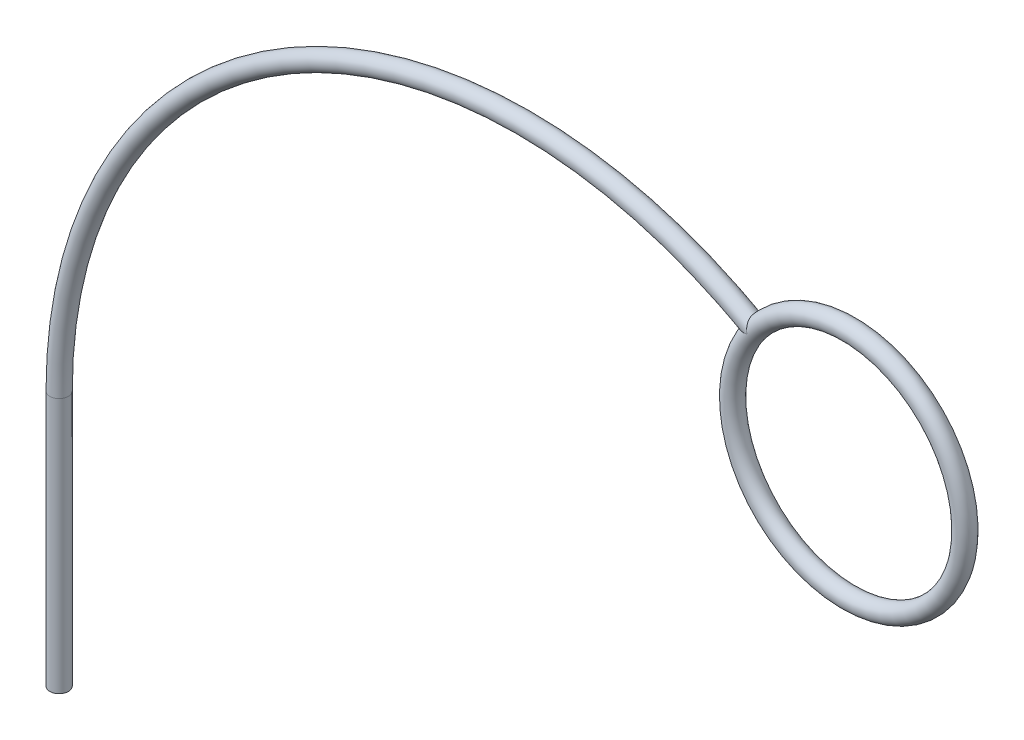
ISO-10303-21;
HEADER;
FILE_DESCRIPTION(('STEP AP214'),'2;1');
FILE_NAME('part.step','',(''),(''),'','','');
FILE_SCHEMA(('AUTOMOTIVE_DESIGN { 1 0 10303 214 1 1 1 1 }'));
ENDSEC;
DATA;
#1=APPLICATION_CONTEXT('core data for automotive mechanical design processes');
#2=APPLICATION_PROTOCOL_DEFINITION('international standard','automotive_design',2000,#1);
#3=PRODUCT_CONTEXT('',#1,'mechanical');
#4=PRODUCT('Part','Part','',(#3));
#5=PRODUCT_RELATED_PRODUCT_CATEGORY('part','',(#4));
#6=PRODUCT_DEFINITION_FORMATION('','',#4);
#7=PRODUCT_DEFINITION_CONTEXT('part definition',#1,'design');
#8=PRODUCT_DEFINITION('design','',#6,#7);
#9=PRODUCT_DEFINITION_SHAPE('','',#8);
#10=(LENGTH_UNIT() NAMED_UNIT(*) SI_UNIT(.MILLI.,.METRE.));
#11=(NAMED_UNIT(*) PLANE_ANGLE_UNIT() SI_UNIT($,.RADIAN.));
#12=(NAMED_UNIT(*) SI_UNIT($,.STERADIAN.) SOLID_ANGLE_UNIT());
#13=UNCERTAINTY_MEASURE_WITH_UNIT(LENGTH_MEASURE(1.E-05),#10,'distance_accuracy_value','');
#14=(GEOMETRIC_REPRESENTATION_CONTEXT(3) GLOBAL_UNCERTAINTY_ASSIGNED_CONTEXT((#13)) GLOBAL_UNIT_ASSIGNED_CONTEXT((#10,
#11,#12)) REPRESENTATION_CONTEXT('',''));
#15=CARTESIAN_POINT('',(0.,0.,0.));
#16=DIRECTION('',(0.,0.,1.));
#17=DIRECTION('',(1.,0.,0.));
#18=AXIS2_PLACEMENT_3D('',#15,#16,#17);
#19=CARTESIAN_POINT('',(18.2815570628505,3.6246661446639,0.));
#20=DIRECTION('',(0.,0.,-1.));
#21=DIRECTION('',(-1.,0.,0.));
#22=AXIS2_PLACEMENT_3D('',#19,#20,#21);
#23=TOROIDAL_SURFACE('',#22,20.,0.4);
#24=CARTESIAN_POINT('',(-1.7184429371495,3.6246661446639,0.));
#25=DIRECTION('',(0.,1.,0.));
#26=DIRECTION('',(0.,0.,1.));
#27=AXIS2_PLACEMENT_3D('',#24,#25,#26);
#28=CIRCLE('',#27,0.4);
#29=CARTESIAN_POINT('',(-1.7184429371495,3.6246661446639,0.4));
#30=VERTEX_POINT('',#29);
#31=EDGE_CURVE('E11',#30,#30,#28,.T.);
#32=ORIENTED_EDGE('',*,*,#31,.T.);
#33=EDGE_LOOP('',(#32));
#34=FACE_BOUND('',#33,.T.);
#35=CARTESIAN_POINT('',(28.2815570628505,20.9451742203527,-0.4));
#36=CARTESIAN_POINT('',(28.2802449825687,20.9449094316311,-0.399999985185975));
#37=CARTESIAN_POINT('',(28.2789328875301,20.9446443803772,-0.399997046519748));
#38=CARTESIAN_POINT('',(28.2300372082474,20.9347574989657,-0.399778371642649));
#39=CARTESIAN_POINT('',(28.1824541964685,20.9247953332454,-0.395712912776125));
#40=CARTESIAN_POINT('',(28.0886786609039,20.9045164332839,-0.379338898890182));
#41=CARTESIAN_POINT('',(28.0424879912974,20.8941992623015,-0.367019818997793));
#42=CARTESIAN_POINT('',(27.9709202273098,20.8777632566153,-0.339678796931704));
#43=CARTESIAN_POINT('',(27.9444412842281,20.8715737428396,-0.327576474530821));
#44=CARTESIAN_POINT('',(27.8935286241451,20.8594906103549,-0.29954318114244));
#45=CARTESIAN_POINT('',(27.8690907584986,20.8535964016875,-0.283620244413451));
#46=CARTESIAN_POINT('',(27.8289330575779,20.8437854611385,-0.252008199426075));
#47=CARTESIAN_POINT('',(27.8125431482702,20.8397377565341,-0.237215157459504));
#48=CARTESIAN_POINT('',(27.7822271689137,20.8321892973009,-0.205152010422065));
#49=CARTESIAN_POINT('',(27.7682978338793,20.8286878186067,-0.187885243763828));
#50=CARTESIAN_POINT('',(27.746470145193,20.8231670007181,-0.155022206934537));
#51=CARTESIAN_POINT('',(27.7379190697795,20.8209910061566,-0.139888087779509));
#52=CARTESIAN_POINT('',(27.7233366205699,20.8172674066555,-0.10837117755116));
#53=CARTESIAN_POINT('',(27.7173034168709,20.8157193453786,-0.0919893035785469));
#54=CARTESIAN_POINT('',(27.708162024422,20.8133696326615,-0.0582377716207111));
#55=CARTESIAN_POINT('',(27.7050748709504,20.8125733494632,-0.0408619353274321));
#56=CARTESIAN_POINT('',(27.7021791365866,20.8118265339348,-0.00582133855980215));
#57=CARTESIAN_POINT('',(27.7023690656429,20.8118756172263,0.0118432869554302));
#58=CARTESIAN_POINT('',(27.705797851746,20.8127597016421,0.0448425478468128));
#59=CARTESIAN_POINT('',(27.708693531981,20.8135062409989,0.0602169169853818));
#60=CARTESIAN_POINT('',(27.7168445604847,20.8156014115963,0.0902783005875124));
#61=CARTESIAN_POINT('',(27.7221003125876,20.8169501458789,0.104965196941813));
#62=CARTESIAN_POINT('',(27.7349355445933,20.8202303133207,0.133983255863529));
#63=CARTESIAN_POINT('',(27.7426063637904,20.8221845921845,0.148270975428817));
#64=CARTESIAN_POINT('',(27.7597902611328,20.8265388965787,0.175607701456373));
#65=CARTESIAN_POINT('',(27.7693042851004,20.8289391509311,0.188656066811256));
#66=CARTESIAN_POINT('',(27.7957352768268,20.8355649599992,0.220601287775842));
#67=CARTESIAN_POINT('',(27.8137579910303,20.8400450589807,0.23853303258873));
#68=CARTESIAN_POINT('',(27.8523699309877,20.8495275701599,0.271224662175176));
#69=CARTESIAN_POINT('',(27.8729659859757,20.8545313662046,0.285975811109096));
#70=CARTESIAN_POINT('',(27.9253472367563,20.8670858461516,0.318335228379443));
#71=CARTESIAN_POINT('',(27.9580745120939,20.8747901002297,0.334353948340157));
#72=CARTESIAN_POINT('',(28.0256103020936,20.8903423357701,0.36092009609409));
#73=CARTESIAN_POINT('',(28.0604209968208,20.898190461606,0.371461676971787));
#74=CARTESIAN_POINT('',(28.1255838408933,20.912535896166,0.386322647025955));
#75=CARTESIAN_POINT('',(28.1557736632117,20.9190510993041,0.391360990795307));
#76=CARTESIAN_POINT('',(28.2165129465614,20.9318829420326,0.398123765955283));
#77=CARTESIAN_POINT('',(28.2470616403969,20.9381999261265,0.399854300627917));
#78=CARTESIAN_POINT('',(28.2789328687982,20.9446443755551,0.399997055411889));
#79=CARTESIAN_POINT('',(28.2802449639673,20.9449094267799,0.399999994492733));
#80=CARTESIAN_POINT('',(28.2815570628505,20.9451742203527,0.4));
#81=B_SPLINE_CURVE_WITH_KNOTS('',3,(#35,#36,#37,#38,#39,#40,#41,#42,#43,#44,#45,#46,#47,#48,#49,
#50,#51,#52,#53,#54,#55,#56,#57,#58,#59,#60,#61,#62,#63,#64,#65,#66,#67,#68,#69,#70,#71,#72,#73,
#74,#75,#76,#77,#78,#79,#80),.UNSPECIFIED.,.F.,.F.,(4,2,2,2,2,2,2,2,2,2,2,2,2,2,2,2,2,2,2,2,2,2,
4),(0.,0.00401578915933876,0.149649833449716,0.295469942080937,0.38451773264468,
0.473379883479211,0.540499240298709,0.607528854919576,0.659880595409205,0.712194221907371,
0.7648786415831,0.817539106897504,0.864313278724592,0.911095457177411,0.959917733280874,
1.00876512873317,1.08577364173073,1.16299104582411,1.27411429112072,1.38535591941979,
1.47905948025973,1.57258997990139,1.57660576906311),.UNSPECIFIED.);
#82=CARTESIAN_POINT('',(28.2815570628505,20.9451742203527,-0.4));
#83=VERTEX_POINT('',#82);
#84=CARTESIAN_POINT('',(28.2815570628505,20.9451742203527,0.4));
#85=VERTEX_POINT('',#84);
#86=EDGE_CURVE('E48',#83,#85,#81,.T.);
#87=ORIENTED_EDGE('',*,*,#86,.T.);
#88=CARTESIAN_POINT('',(28.2815570628505,20.9451742203527,0.4));
#89=CARTESIAN_POINT('',(28.2812922728258,20.9464862894907,0.399999996480052));
#90=CARTESIAN_POINT('',(28.2810275987682,20.9477984641574,0.39999621751838));
#91=CARTESIAN_POINT('',(28.2740910241506,20.9822057152842,0.399797996476));
#92=CARTESIAN_POINT('',(28.2674957916757,21.0153516338675,0.397202464705719));
#93=CARTESIAN_POINT('',(28.2545982753955,21.0809963514477,0.387013700675565));
#94=CARTESIAN_POINT('',(28.2482966285181,21.1134936633337,0.379410099042617));
#95=CARTESIAN_POINT('',(28.2368865915436,21.1730445336489,0.360166342907344));
#96=CARTESIAN_POINT('',(28.231726159233,21.200280414189,0.349127337046165));
#97=CARTESIAN_POINT('',(28.2218942952133,21.2526814751104,0.322762140140864));
#98=CARTESIAN_POINT('',(28.2172220671627,21.2778500128535,0.307443085437196));
#99=CARTESIAN_POINT('',(28.2094833853613,21.3198947928911,0.276202396829843));
#100=CARTESIAN_POINT('',(28.2062888102704,21.3373833021107,0.261138362877634));
#101=CARTESIAN_POINT('',(28.2004107210021,21.3697486456689,0.22833042769784));
#102=CARTESIAN_POINT('',(28.1977266346696,21.384628402414,0.210589567145107));
#103=CARTESIAN_POINT('',(28.193390165756,21.4087761289699,0.175819148972092));
#104=CARTESIAN_POINT('',(28.1916403449434,21.4185662865588,0.159165585899899));
#105=CARTESIAN_POINT('',(28.1886585408546,21.4352942879756,0.124431493648688));
#106=CARTESIAN_POINT('',(28.1874262985301,21.4422335586358,0.106351683702201));
#107=CARTESIAN_POINT('',(28.185541592476,21.4528622872585,0.069117437216042));
#108=CARTESIAN_POINT('',(28.184892208839,21.4565344795963,0.0499578537915269));
#109=CARTESIAN_POINT('',(28.1842264682629,21.4602992664218,0.0112790867986551));
#110=CARTESIAN_POINT('',(28.184209894047,21.4603930895518,-0.00823997104016869));
#111=CARTESIAN_POINT('',(28.1847825152324,21.4571547468411,-0.0451872934283969));
#112=CARTESIAN_POINT('',(28.1853169186655,21.4541324615965,-0.0626446556382024));
#113=CARTESIAN_POINT('',(28.1868799131105,21.44531302505,-0.0968143770864779));
#114=CARTESIAN_POINT('',(28.18790851626,21.4395158055953,-0.113526718016116));
#115=CARTESIAN_POINT('',(28.1904436150865,21.4252737635436,-0.146246604723519));
#116=CARTESIAN_POINT('',(28.1919616611796,21.4167650142421,-0.162225190098286));
#117=CARTESIAN_POINT('',(28.1954043401687,21.3975484001472,-0.192744305024633));
#118=CARTESIAN_POINT('',(28.1973291783575,21.3868394250577,-0.207284103013286));
#119=CARTESIAN_POINT('',(28.2023594934824,21.3589889449757,-0.240252233519621));
#120=CARTESIAN_POINT('',(28.2056300701682,21.3409829972403,-0.2579273954736));
#121=CARTESIAN_POINT('',(28.212697774949,21.3023831947336,-0.290063497685552));
#122=CARTESIAN_POINT('',(28.2164959565155,21.2817841702664,-0.304517852719945));
#123=CARTESIAN_POINT('',(28.2256411456798,21.2326193692146,-0.333926825631399));
#124=CARTESIAN_POINT('',(28.2311205812959,21.2034591637246,-0.347843953312381));
#125=CARTESIAN_POINT('',(28.2425522940585,21.1433586363662,-0.370676033781062));
#126=CARTESIAN_POINT('',(28.2485047336426,21.1124177039802,-0.379589259593836));
#127=CARTESIAN_POINT('',(28.2588498974369,21.0593119181389,-0.390668403963429));
#128=CARTESIAN_POINT('',(28.2631591730693,21.03737515589,-0.394066451100002));
#129=CARTESIAN_POINT('',(28.2718883099603,20.993323525359,-0.39866105301123));
#130=CARTESIAN_POINT('',(28.276307972871,20.9712090190181,-0.39986130373406));
#131=CARTESIAN_POINT('',(28.2810275946795,20.947798486945,-0.399996220058487));
#132=CARTESIAN_POINT('',(28.2812922687805,20.9464863121514,-0.399999999312469));
#133=CARTESIAN_POINT('',(28.2815570628505,20.9451742203527,-0.4));
#134=B_SPLINE_CURVE_WITH_KNOTS('',3,(#88,#89,#90,#91,#92,#93,#94,#95,#96,#97,#98,#99,#100,#101,
#102,#103,#104,#105,#106,#107,#108,#109,#110,#111,#112,#113,#114,#115,#116,#117,#118,#119,#120,
#121,#122,#123,#124,#125,#126,#127,#128,#129,#130,#131,#132,#133),.UNSPECIFIED.,.F.,.F.,(4,2,2,
2,2,2,2,2,2,2,2,2,2,2,2,2,2,2,2,2,2,2,4),(0.,0.00401579543701398,0.105293948811801,
0.206782463939987,0.295966673996055,0.385003061152073,0.454651354010079,0.524221119078709,
0.582172636276526,0.640095114046002,0.698321908730389,0.756528710914427,0.809457603528397,
0.862387796148981,0.916671815841456,0.970983296363984,1.04689409454745,1.12295870324655,
1.22076071400648,1.31859645803187,1.38633743729087,1.45396439420823,1.45798018964524),.UNSPECIFIED.);
#135=EDGE_CURVE('E46',#85,#83,#134,.T.);
#136=ORIENTED_EDGE('',*,*,#135,.T.);
#137=EDGE_LOOP('',(#87,#136));
#138=FACE_BOUND('',#137,.T.);
#139=ADVANCED_FACE('F32',(#34,#138),#23,.T.);
#140=CARTESIAN_POINT('',(-1.7184429371495,3.6246661446639,0.));
#141=DIRECTION('',(0.,-1.,0.));
#142=DIRECTION('',(0.,0.,-1.));
#143=AXIS2_PLACEMENT_3D('',#140,#141,#142);
#144=CYLINDRICAL_SURFACE('',#143,0.4);
#145=ORIENTED_EDGE('',*,*,#31,.F.);
#146=EDGE_LOOP('',(#145));
#147=FACE_BOUND('',#146,.T.);
#148=CARTESIAN_POINT('',(-1.7184429371495,-7.3753338553361,0.));
#149=DIRECTION('',(0.,1.,0.));
#150=DIRECTION('',(0.,0.,1.));
#151=AXIS2_PLACEMENT_3D('',#148,#149,#150);
#152=CIRCLE('',#151,0.4);
#153=CARTESIAN_POINT('',(-1.7184429371495,-7.3753338553361,0.4));
#154=VERTEX_POINT('',#153);
#155=EDGE_CURVE('E36',#154,#154,#152,.T.);
#156=ORIENTED_EDGE('',*,*,#155,.T.);
#157=EDGE_LOOP('',(#156));
#158=FACE_BOUND('',#157,.T.);
#159=ADVANCED_FACE('F67',(#147,#158),#144,.T.);
#160=CARTESIAN_POINT('',(-1.7184429371495,-7.3753338553361,0.));
#161=DIRECTION('',(0.,1.,0.));
#162=DIRECTION('',(0.,0.,1.));
#163=AXIS2_PLACEMENT_3D('',#160,#161,#162);
#164=PLANE('',#163);
#165=ORIENTED_EDGE('',*,*,#155,.F.);
#166=EDGE_LOOP('',(#165));
#167=FACE_BOUND('',#166,.T.);
#168=ADVANCED_FACE('F64',(#167),#164,.F.);
#169=CARTESIAN_POINT('',(32.2652217768716,17.9235164888643,0.));
#170=DIRECTION('',(0.,0.,-1.));
#171=DIRECTION('',(-1.,0.,0.));
#172=AXIS2_PLACEMENT_3D('',#169,#170,#171);
#173=TOROIDAL_SURFACE('',#172,5.00000000000001,0.4);
#174=ORIENTED_EDGE('',*,*,#135,.F.);
#175=ORIENTED_EDGE('',*,*,#86,.F.);
#176=EDGE_LOOP('',(#174,#175));
#177=FACE_BOUND('',#176,.T.);
#178=ADVANCED_FACE('F49',(#177),#173,.T.);
#179=CLOSED_SHELL('',(#139,#159,#168,#178));
#180=MANIFOLD_SOLID_BREP('B2',#179);
#181=ADVANCED_BREP_SHAPE_REPRESENTATION('',(#18,#180),#14);
#182=SHAPE_DEFINITION_REPRESENTATION(#9,#181);
ENDSEC;
END-ISO-10303-21;
